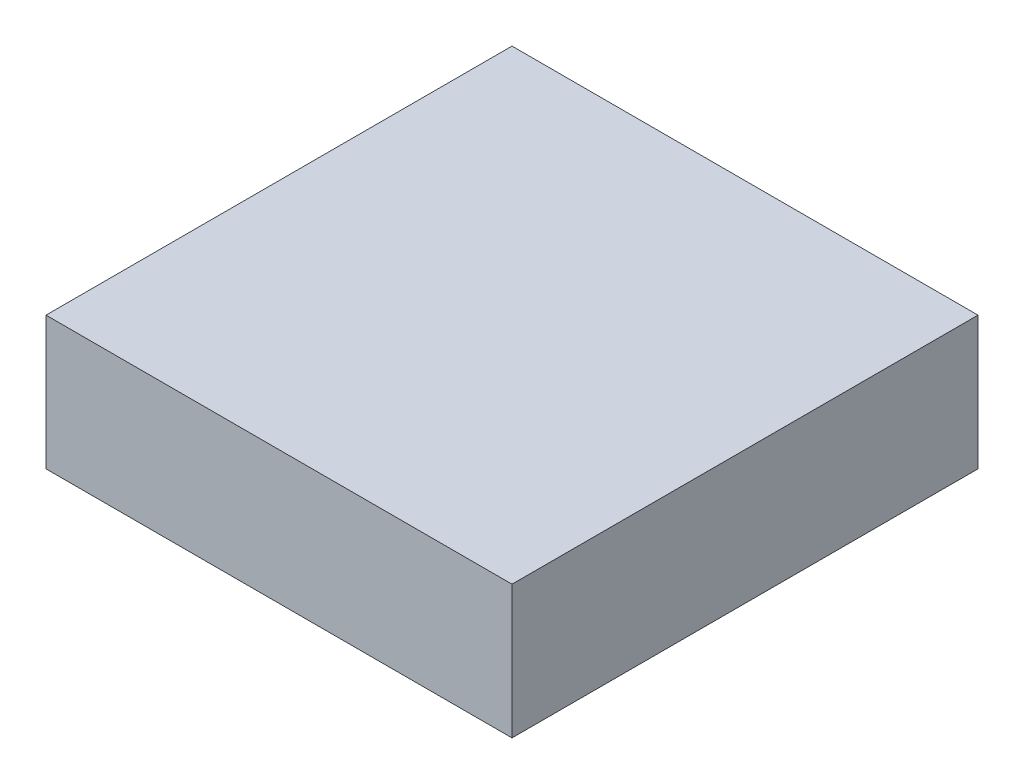
ISO-10303-21;
HEADER;
FILE_DESCRIPTION(('STEP AP214'),'2;1');
FILE_NAME('part.step','',(''),(''),'','','');
FILE_SCHEMA(('AUTOMOTIVE_DESIGN { 1 0 10303 214 1 1 1 1 }'));
ENDSEC;
DATA;
#1=APPLICATION_CONTEXT('core data for automotive mechanical design processes');
#2=APPLICATION_PROTOCOL_DEFINITION('international standard','automotive_design',2000,#1);
#3=PRODUCT_CONTEXT('',#1,'mechanical');
#4=PRODUCT('Part','Part','',(#3));
#5=PRODUCT_RELATED_PRODUCT_CATEGORY('part','',(#4));
#6=PRODUCT_DEFINITION_FORMATION('','',#4);
#7=PRODUCT_DEFINITION_CONTEXT('part definition',#1,'design');
#8=PRODUCT_DEFINITION('design','',#6,#7);
#9=PRODUCT_DEFINITION_SHAPE('','',#8);
#10=(LENGTH_UNIT() NAMED_UNIT(*) SI_UNIT(.MILLI.,.METRE.));
#11=(NAMED_UNIT(*) PLANE_ANGLE_UNIT() SI_UNIT($,.RADIAN.));
#12=(NAMED_UNIT(*) SI_UNIT($,.STERADIAN.) SOLID_ANGLE_UNIT());
#13=UNCERTAINTY_MEASURE_WITH_UNIT(LENGTH_MEASURE(1.E-05),#10,'distance_accuracy_value','');
#14=(GEOMETRIC_REPRESENTATION_CONTEXT(3) GLOBAL_UNCERTAINTY_ASSIGNED_CONTEXT((#13)) GLOBAL_UNIT_ASSIGNED_CONTEXT((#10,
#11,#12)) REPRESENTATION_CONTEXT('',''));
#15=CARTESIAN_POINT('',(0.,0.,0.));
#16=DIRECTION('',(0.,0.,1.));
#17=DIRECTION('',(1.,0.,0.));
#18=AXIS2_PLACEMENT_3D('',#15,#16,#17);
#19=CARTESIAN_POINT('',(17.5,10.,-17.5));
#20=DIRECTION('',(-1.,0.,0.));
#21=DIRECTION('',(0.,0.,1.));
#22=AXIS2_PLACEMENT_3D('',#19,#20,#21);
#23=PLANE('',#22);
#24=DIRECTION('',(0.,0.,-1.));
#25=VECTOR('',#24,1.);
#26=CARTESIAN_POINT('',(17.5,0.,-17.5));
#27=LINE('',#26,#25);
#28=CARTESIAN_POINT('',(17.5,0.,17.5));
#29=VERTEX_POINT('',#28);
#30=CARTESIAN_POINT('',(17.5,0.,-17.5));
#31=VERTEX_POINT('',#30);
#32=EDGE_CURVE('E102',#29,#31,#27,.T.);
#33=ORIENTED_EDGE('',*,*,#32,.T.);
#34=DIRECTION('',(0.,-1.,0.));
#35=VECTOR('',#34,1.);
#36=CARTESIAN_POINT('',(17.5,10.,-17.5));
#37=LINE('',#36,#35);
#38=CARTESIAN_POINT('',(17.5,10.,-17.5));
#39=VERTEX_POINT('',#38);
#40=EDGE_CURVE('E11',#39,#31,#37,.T.);
#41=ORIENTED_EDGE('',*,*,#40,.F.);
#42=DIRECTION('',(0.,0.,-1.));
#43=VECTOR('',#42,1.);
#44=CARTESIAN_POINT('',(17.5,10.,-17.5));
#45=LINE('',#44,#43);
#46=CARTESIAN_POINT('',(17.5,10.,17.5));
#47=VERTEX_POINT('',#46);
#48=EDGE_CURVE('E90',#47,#39,#45,.T.);
#49=ORIENTED_EDGE('',*,*,#48,.F.);
#50=DIRECTION('',(0.,-1.,0.));
#51=VECTOR('',#50,1.);
#52=CARTESIAN_POINT('',(17.5,10.,17.5));
#53=LINE('',#52,#51);
#54=EDGE_CURVE('E98',#47,#29,#53,.T.);
#55=ORIENTED_EDGE('',*,*,#54,.T.);
#56=EDGE_LOOP('',(#33,#41,#49,#55));
#57=FACE_BOUND('',#56,.T.);
#58=ADVANCED_FACE('F39',(#57),#23,.F.);
#59=CARTESIAN_POINT('',(-17.5,10.,-17.5));
#60=DIRECTION('',(0.,0.,1.));
#61=DIRECTION('',(1.,0.,0.));
#62=AXIS2_PLACEMENT_3D('',#59,#60,#61);
#63=PLANE('',#62);
#64=DIRECTION('',(-1.,0.,0.));
#65=VECTOR('',#64,1.);
#66=CARTESIAN_POINT('',(-17.5,0.,-17.5));
#67=LINE('',#66,#65);
#68=CARTESIAN_POINT('',(-17.5,0.,-17.5));
#69=VERTEX_POINT('',#68);
#70=EDGE_CURVE('E94',#31,#69,#67,.T.);
#71=ORIENTED_EDGE('',*,*,#70,.T.);
#72=DIRECTION('',(0.,-1.,0.));
#73=VECTOR('',#72,1.);
#74=CARTESIAN_POINT('',(-17.5,10.,-17.5));
#75=LINE('',#74,#73);
#76=CARTESIAN_POINT('',(-17.5,10.,-17.5));
#77=VERTEX_POINT('',#76);
#78=EDGE_CURVE('E47',#77,#69,#75,.T.);
#79=ORIENTED_EDGE('',*,*,#78,.F.);
#80=DIRECTION('',(-1.,0.,0.));
#81=VECTOR('',#80,1.);
#82=CARTESIAN_POINT('',(-17.5,10.,-17.5));
#83=LINE('',#82,#81);
#84=EDGE_CURVE('E85',#39,#77,#83,.T.);
#85=ORIENTED_EDGE('',*,*,#84,.F.);
#86=ORIENTED_EDGE('',*,*,#40,.T.);
#87=EDGE_LOOP('',(#71,#79,#85,#86));
#88=FACE_BOUND('',#87,.T.);
#89=ADVANCED_FACE('F93',(#88),#63,.F.);
#90=CARTESIAN_POINT('',(-17.5,10.,-17.5));
#91=DIRECTION('',(1.,0.,0.));
#92=DIRECTION('',(0.,0.,-1.));
#93=AXIS2_PLACEMENT_3D('',#90,#91,#92);
#94=PLANE('',#93);
#95=DIRECTION('',(0.,0.,1.));
#96=VECTOR('',#95,1.);
#97=CARTESIAN_POINT('',(-17.5,0.,-17.5));
#98=LINE('',#97,#96);
#99=CARTESIAN_POINT('',(-17.5,0.,17.5));
#100=VERTEX_POINT('',#99);
#101=EDGE_CURVE('E72',#69,#100,#98,.T.);
#102=ORIENTED_EDGE('',*,*,#101,.T.);
#103=DIRECTION('',(0.,-1.,0.));
#104=VECTOR('',#103,1.);
#105=CARTESIAN_POINT('',(-17.5,10.,17.5));
#106=LINE('',#105,#104);
#107=CARTESIAN_POINT('',(-17.5,10.,17.5));
#108=VERTEX_POINT('',#107);
#109=EDGE_CURVE('E95',#108,#100,#106,.T.);
#110=ORIENTED_EDGE('',*,*,#109,.F.);
#111=DIRECTION('',(0.,0.,1.));
#112=VECTOR('',#111,1.);
#113=CARTESIAN_POINT('',(-17.5,10.,-17.5));
#114=LINE('',#113,#112);
#115=EDGE_CURVE('E88',#77,#108,#114,.T.);
#116=ORIENTED_EDGE('',*,*,#115,.F.);
#117=ORIENTED_EDGE('',*,*,#78,.T.);
#118=EDGE_LOOP('',(#102,#110,#116,#117));
#119=FACE_BOUND('',#118,.T.);
#120=ADVANCED_FACE('F96',(#119),#94,.F.);
#121=CARTESIAN_POINT('',(-17.5,10.,17.5));
#122=DIRECTION('',(0.,0.,-1.));
#123=DIRECTION('',(-1.,0.,0.));
#124=AXIS2_PLACEMENT_3D('',#121,#122,#123);
#125=PLANE('',#124);
#126=DIRECTION('',(1.,0.,0.));
#127=VECTOR('',#126,1.);
#128=CARTESIAN_POINT('',(-17.5,0.,17.5));
#129=LINE('',#128,#127);
#130=EDGE_CURVE('E78',#100,#29,#129,.T.);
#131=ORIENTED_EDGE('',*,*,#130,.T.);
#132=ORIENTED_EDGE('',*,*,#54,.F.);
#133=DIRECTION('',(1.,0.,0.));
#134=VECTOR('',#133,1.);
#135=CARTESIAN_POINT('',(-17.5,10.,17.5));
#136=LINE('',#135,#134);
#137=EDGE_CURVE('E55',#108,#47,#136,.T.);
#138=ORIENTED_EDGE('',*,*,#137,.F.);
#139=ORIENTED_EDGE('',*,*,#109,.T.);
#140=EDGE_LOOP('',(#131,#132,#138,#139));
#141=FACE_BOUND('',#140,.T.);
#142=ADVANCED_FACE('F109',(#141),#125,.F.);
#143=CARTESIAN_POINT('',(0.,10.,0.));
#144=DIRECTION('',(0.,1.,0.));
#145=DIRECTION('',(0.,0.,1.));
#146=AXIS2_PLACEMENT_3D('',#143,#144,#145);
#147=PLANE('',#146);
#148=ORIENTED_EDGE('',*,*,#48,.T.);
#149=ORIENTED_EDGE('',*,*,#84,.T.);
#150=ORIENTED_EDGE('',*,*,#115,.T.);
#151=ORIENTED_EDGE('',*,*,#137,.T.);
#152=EDGE_LOOP('',(#148,#149,#150,#151));
#153=FACE_BOUND('',#152,.T.);
#154=ADVANCED_FACE('F86',(#153),#147,.T.);
#155=CARTESIAN_POINT('',(0.,0.,0.));
#156=DIRECTION('',(0.,1.,0.));
#157=DIRECTION('',(0.,0.,1.));
#158=AXIS2_PLACEMENT_3D('',#155,#156,#157);
#159=PLANE('',#158);
#160=ORIENTED_EDGE('',*,*,#32,.F.);
#161=ORIENTED_EDGE('',*,*,#130,.F.);
#162=ORIENTED_EDGE('',*,*,#101,.F.);
#163=ORIENTED_EDGE('',*,*,#70,.F.);
#164=EDGE_LOOP('',(#160,#161,#162,#163));
#165=FACE_BOUND('',#164,.T.);
#166=ADVANCED_FACE('F112',(#165),#159,.F.);
#167=CLOSED_SHELL('',(#58,#89,#120,#142,#154,#166));
#168=MANIFOLD_SOLID_BREP('B2',#167);
#169=ADVANCED_BREP_SHAPE_REPRESENTATION('',(#18,#168),#14);
#170=SHAPE_DEFINITION_REPRESENTATION(#9,#169);
ENDSEC;
END-ISO-10303-21;
